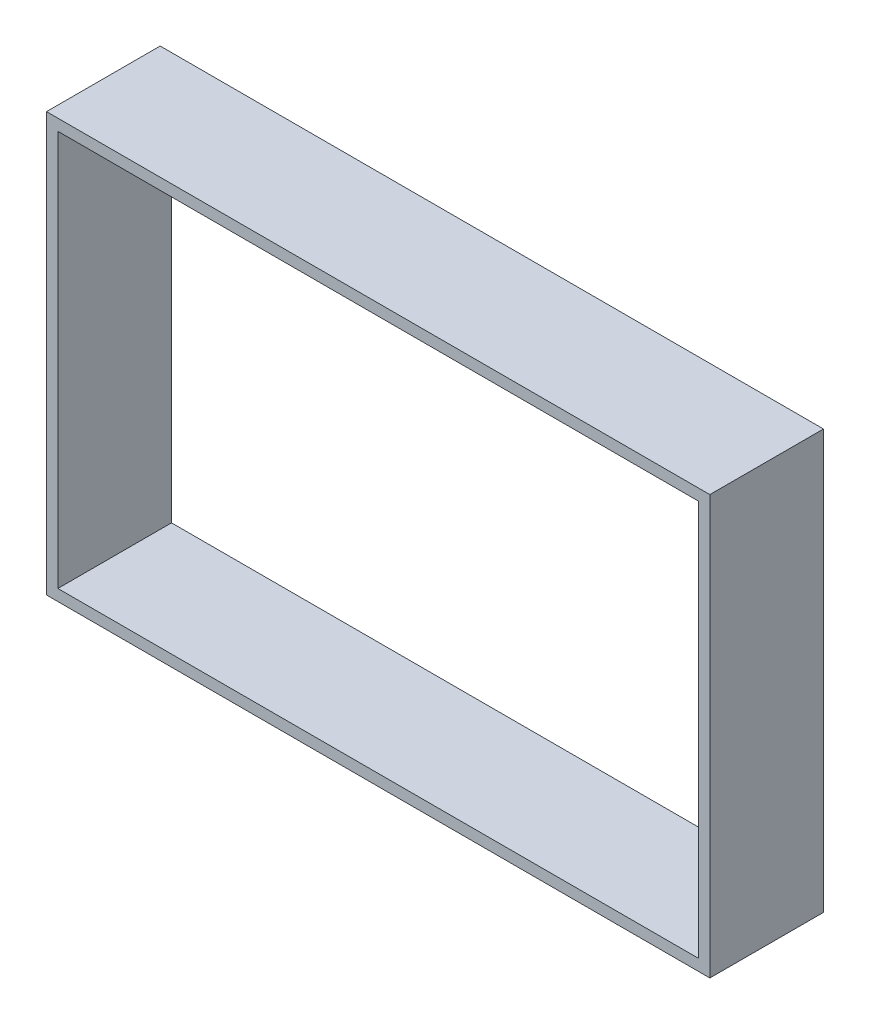
ISO-10303-21;
HEADER;
FILE_DESCRIPTION(('STEP AP214'),'2;1');
FILE_NAME('part.step','',(''),(''),'','','');
FILE_SCHEMA(('AUTOMOTIVE_DESIGN { 1 0 10303 214 1 1 1 1 }'));
ENDSEC;
DATA;
#1=APPLICATION_CONTEXT('core data for automotive mechanical design processes');
#2=APPLICATION_PROTOCOL_DEFINITION('international standard','automotive_design',2000,#1);
#3=PRODUCT_CONTEXT('',#1,'mechanical');
#4=PRODUCT('Part','Part','',(#3));
#5=PRODUCT_RELATED_PRODUCT_CATEGORY('part','',(#4));
#6=PRODUCT_DEFINITION_FORMATION('','',#4);
#7=PRODUCT_DEFINITION_CONTEXT('part definition',#1,'design');
#8=PRODUCT_DEFINITION('design','',#6,#7);
#9=PRODUCT_DEFINITION_SHAPE('','',#8);
#10=(LENGTH_UNIT() NAMED_UNIT(*) SI_UNIT(.MILLI.,.METRE.));
#11=(NAMED_UNIT(*) PLANE_ANGLE_UNIT() SI_UNIT($,.RADIAN.));
#12=(NAMED_UNIT(*) SI_UNIT($,.STERADIAN.) SOLID_ANGLE_UNIT());
#13=UNCERTAINTY_MEASURE_WITH_UNIT(LENGTH_MEASURE(1.E-05),#10,'distance_accuracy_value','');
#14=(GEOMETRIC_REPRESENTATION_CONTEXT(3) GLOBAL_UNCERTAINTY_ASSIGNED_CONTEXT((#13)) GLOBAL_UNIT_ASSIGNED_CONTEXT((#10,
#11,#12)) REPRESENTATION_CONTEXT('',''));
#15=CARTESIAN_POINT('',(0.,0.,0.));
#16=DIRECTION('',(0.,0.,1.));
#17=DIRECTION('',(1.,0.,0.));
#18=AXIS2_PLACEMENT_3D('',#15,#16,#17);
#19=CARTESIAN_POINT('',(-558.293182196081,40.5041750189231,2108.04537891594));
#20=DIRECTION('',(0.,-1.,0.));
#21=DIRECTION('',(1.,0.,0.));
#22=AXIS2_PLACEMENT_3D('',#19,#20,#21);
#23=PLANE('',#22);
#24=DIRECTION('',(-1.,0.,0.));
#25=VECTOR('',#24,1.);
#26=CARTESIAN_POINT('',(-558.293182196081,40.5041750189231,2008.04537891594));
#27=LINE('',#26,#25);
#28=CARTESIAN_POINT('',(23.4068178039194,40.5041750189231,2008.04537891594));
#29=VERTEX_POINT('',#28);
#30=CARTESIAN_POINT('',(-560.293182196081,40.5041750189231,2008.04537891594));
#31=VERTEX_POINT('',#30);
#32=EDGE_CURVE('E51',#29,#31,#27,.T.);
#33=ORIENTED_EDGE('',*,*,#32,.F.);
#34=DIRECTION('',(0.,0.,-1.));
#35=VECTOR('',#34,1.);
#36=CARTESIAN_POINT('',(23.4068178039194,40.5041750189231,2476.45080775759));
#37=LINE('',#36,#35);
#38=CARTESIAN_POINT('',(23.4068178039194,40.5041750189231,2108.04537891594));
#39=VERTEX_POINT('',#38);
#40=EDGE_CURVE('E166',#39,#29,#37,.T.);
#41=ORIENTED_EDGE('',*,*,#40,.F.);
#42=DIRECTION('',(-1.,0.,0.));
#43=VECTOR('',#42,1.);
#44=CARTESIAN_POINT('',(-558.293182196081,40.5041750189231,2108.04537891594));
#45=LINE('',#44,#43);
#46=CARTESIAN_POINT('',(-560.293182196081,40.5041750189231,2108.04537891594));
#47=VERTEX_POINT('',#46);
#48=EDGE_CURVE('E12',#39,#47,#45,.T.);
#49=ORIENTED_EDGE('',*,*,#48,.T.);
#50=DIRECTION('',(0.,0.,-1.));
#51=VECTOR('',#50,1.);
#52=CARTESIAN_POINT('',(-560.293182196081,40.5041750189231,2476.45080775759));
#53=LINE('',#52,#51);
#54=EDGE_CURVE('E151',#47,#31,#53,.T.);
#55=ORIENTED_EDGE('',*,*,#54,.T.);
#56=EDGE_LOOP('',(#33,#41,#49,#55));
#57=FACE_BOUND('',#56,.T.);
#58=ADVANCED_FACE('F47',(#57),#23,.T.);
#59=CARTESIAN_POINT('',(-558.293182196081,408.904175018923,2108.04537891594));
#60=DIRECTION('',(0.,1.,0.));
#61=DIRECTION('',(-1.,0.,0.));
#62=AXIS2_PLACEMENT_3D('',#59,#60,#61);
#63=PLANE('',#62);
#64=DIRECTION('',(1.,0.,0.));
#65=VECTOR('',#64,1.);
#66=CARTESIAN_POINT('',(-558.293182196081,408.904175018923,2008.04537891594));
#67=LINE('',#66,#65);
#68=CARTESIAN_POINT('',(-560.293182196081,408.904175018923,2008.04537891594));
#69=VERTEX_POINT('',#68);
#70=CARTESIAN_POINT('',(23.4068178039194,408.904175018923,2008.04537891594));
#71=VERTEX_POINT('',#70);
#72=EDGE_CURVE('E171',#69,#71,#67,.T.);
#73=ORIENTED_EDGE('',*,*,#72,.F.);
#74=DIRECTION('',(0.,0.,-1.));
#75=VECTOR('',#74,1.);
#76=CARTESIAN_POINT('',(-560.293182196081,408.904175018923,2476.45080775759));
#77=LINE('',#76,#75);
#78=CARTESIAN_POINT('',(-560.293182196081,408.904175018923,2108.04537891594));
#79=VERTEX_POINT('',#78);
#80=EDGE_CURVE('E155',#79,#69,#77,.T.);
#81=ORIENTED_EDGE('',*,*,#80,.F.);
#82=DIRECTION('',(1.,0.,0.));
#83=VECTOR('',#82,1.);
#84=CARTESIAN_POINT('',(-558.293182196081,408.904175018923,2108.04537891594));
#85=LINE('',#84,#83);
#86=CARTESIAN_POINT('',(23.4068178039194,408.904175018923,2108.04537891594));
#87=VERTEX_POINT('',#86);
#88=EDGE_CURVE('E57',#79,#87,#85,.T.);
#89=ORIENTED_EDGE('',*,*,#88,.T.);
#90=DIRECTION('',(0.,0.,-1.));
#91=VECTOR('',#90,1.);
#92=CARTESIAN_POINT('',(23.4068178039194,408.904175018923,2476.45080775759));
#93=LINE('',#92,#91);
#94=EDGE_CURVE('E162',#87,#71,#93,.T.);
#95=ORIENTED_EDGE('',*,*,#94,.T.);
#96=EDGE_LOOP('',(#73,#81,#89,#95));
#97=FACE_BOUND('',#96,.T.);
#98=ADVANCED_FACE('F49',(#97),#63,.T.);
#99=CARTESIAN_POINT('',(0.,0.,2108.04537891594));
#100=DIRECTION('',(0.,0.,1.));
#101=DIRECTION('',(1.,0.,0.));
#102=AXIS2_PLACEMENT_3D('',#99,#100,#101);
#103=PLANE('',#102);
#104=DIRECTION('',(1.,0.,0.));
#105=VECTOR('',#104,1.);
#106=CARTESIAN_POINT('',(-548.293182196081,398.904175018923,2108.04537891594));
#107=LINE('',#106,#105);
#108=CARTESIAN_POINT('',(-550.293182196081,398.904175018923,2108.04537891594));
#109=VERTEX_POINT('',#108);
#110=CARTESIAN_POINT('',(13.4068178039194,398.904175018923,2108.04537891594));
#111=VERTEX_POINT('',#110);
#112=EDGE_CURVE('E108',#109,#111,#107,.T.);
#113=ORIENTED_EDGE('',*,*,#112,.T.);
#114=DIRECTION('',(0.,-1.,0.));
#115=VECTOR('',#114,1.);
#116=CARTESIAN_POINT('',(13.4068178039194,398.904175018923,2108.04537891594));
#117=LINE('',#116,#115);
#118=CARTESIAN_POINT('',(13.4068178039193,50.5041750189231,2108.04537891594));
#119=VERTEX_POINT('',#118);
#120=EDGE_CURVE('E112',#111,#119,#117,.T.);
#121=ORIENTED_EDGE('',*,*,#120,.T.);
#122=DIRECTION('',(-1.,0.,0.));
#123=VECTOR('',#122,1.);
#124=CARTESIAN_POINT('',(-548.293182196081,50.5041750189231,2108.04537891594));
#125=LINE('',#124,#123);
#126=CARTESIAN_POINT('',(-550.293182196081,50.5041750189231,2108.04537891594));
#127=VERTEX_POINT('',#126);
#128=EDGE_CURVE('E119',#119,#127,#125,.T.);
#129=ORIENTED_EDGE('',*,*,#128,.T.);
#130=DIRECTION('',(0.,1.,0.));
#131=VECTOR('',#130,1.);
#132=CARTESIAN_POINT('',(-550.293182196081,398.904175018923,2108.04537891594));
#133=LINE('',#132,#131);
#134=EDGE_CURVE('E114',#127,#109,#133,.T.);
#135=ORIENTED_EDGE('',*,*,#134,.T.);
#136=EDGE_LOOP('',(#113,#121,#129,#135));
#137=FACE_BOUND('',#136,.T.);
#138=ORIENTED_EDGE('',*,*,#88,.F.);
#139=DIRECTION('',(0.,1.,0.));
#140=VECTOR('',#139,1.);
#141=CARTESIAN_POINT('',(-560.293182196081,408.904175018923,2108.04537891594));
#142=LINE('',#141,#140);
#143=EDGE_CURVE('E152',#47,#79,#142,.T.);
#144=ORIENTED_EDGE('',*,*,#143,.F.);
#145=ORIENTED_EDGE('',*,*,#48,.F.);
#146=DIRECTION('',(0.,-1.,0.));
#147=VECTOR('',#146,1.);
#148=CARTESIAN_POINT('',(23.4068178039194,408.904175018923,2108.04537891594));
#149=LINE('',#148,#147);
#150=EDGE_CURVE('E163',#87,#39,#149,.T.);
#151=ORIENTED_EDGE('',*,*,#150,.F.);
#152=EDGE_LOOP('',(#138,#144,#145,#151));
#153=FACE_BOUND('',#152,.T.);
#154=ADVANCED_FACE('F110',(#137,#153),#103,.T.);
#155=CARTESIAN_POINT('',(0.,0.,2008.04537891594));
#156=DIRECTION('',(0.,0.,1.));
#157=DIRECTION('',(1.,0.,0.));
#158=AXIS2_PLACEMENT_3D('',#155,#156,#157);
#159=PLANE('',#158);
#160=DIRECTION('',(0.,-1.,0.));
#161=VECTOR('',#160,1.);
#162=CARTESIAN_POINT('',(13.4068178039194,398.904175018923,2008.04537891594));
#163=LINE('',#162,#161);
#164=CARTESIAN_POINT('',(13.4068178039194,398.904175018923,2008.04537891594));
#165=VERTEX_POINT('',#164);
#166=CARTESIAN_POINT('',(13.4068178039193,50.5041750189231,2008.04537891594));
#167=VERTEX_POINT('',#166);
#168=EDGE_CURVE('E134',#165,#167,#163,.T.);
#169=ORIENTED_EDGE('',*,*,#168,.F.);
#170=DIRECTION('',(1.,0.,0.));
#171=VECTOR('',#170,1.);
#172=CARTESIAN_POINT('',(-548.293182196081,398.904175018923,2008.04537891594));
#173=LINE('',#172,#171);
#174=CARTESIAN_POINT('',(-550.293182196081,398.904175018923,2008.04537891594));
#175=VERTEX_POINT('',#174);
#176=EDGE_CURVE('E133',#175,#165,#173,.T.);
#177=ORIENTED_EDGE('',*,*,#176,.F.);
#178=DIRECTION('',(0.,1.,0.));
#179=VECTOR('',#178,1.);
#180=CARTESIAN_POINT('',(-550.293182196081,398.904175018923,2008.04537891594));
#181=LINE('',#180,#179);
#182=CARTESIAN_POINT('',(-550.293182196081,50.5041750189231,2008.04537891594));
#183=VERTEX_POINT('',#182);
#184=EDGE_CURVE('E140',#183,#175,#181,.T.);
#185=ORIENTED_EDGE('',*,*,#184,.F.);
#186=DIRECTION('',(-1.,0.,0.));
#187=VECTOR('',#186,1.);
#188=CARTESIAN_POINT('',(-548.293182196081,50.5041750189231,2008.04537891594));
#189=LINE('',#188,#187);
#190=EDGE_CURVE('E120',#167,#183,#189,.T.);
#191=ORIENTED_EDGE('',*,*,#190,.F.);
#192=EDGE_LOOP('',(#169,#177,#185,#191));
#193=FACE_BOUND('',#192,.T.);
#194=ORIENTED_EDGE('',*,*,#32,.T.);
#195=DIRECTION('',(0.,1.,0.));
#196=VECTOR('',#195,1.);
#197=CARTESIAN_POINT('',(-560.293182196081,408.904175018923,2008.04537891594));
#198=LINE('',#197,#196);
#199=EDGE_CURVE('E148',#31,#69,#198,.T.);
#200=ORIENTED_EDGE('',*,*,#199,.T.);
#201=ORIENTED_EDGE('',*,*,#72,.T.);
#202=DIRECTION('',(0.,-1.,0.));
#203=VECTOR('',#202,1.);
#204=CARTESIAN_POINT('',(23.4068178039194,408.904175018923,2008.04537891594));
#205=LINE('',#204,#203);
#206=EDGE_CURVE('E158',#71,#29,#205,.T.);
#207=ORIENTED_EDGE('',*,*,#206,.T.);
#208=EDGE_LOOP('',(#194,#200,#201,#207));
#209=FACE_BOUND('',#208,.T.);
#210=ADVANCED_FACE('F175',(#193,#209),#159,.F.);
#211=CARTESIAN_POINT('',(-548.293182196081,50.5041750189231,2108.04537891594));
#212=DIRECTION('',(0.,-1.,0.));
#213=DIRECTION('',(1.,0.,0.));
#214=AXIS2_PLACEMENT_3D('',#211,#212,#213);
#215=PLANE('',#214);
#216=ORIENTED_EDGE('',*,*,#190,.T.);
#217=DIRECTION('',(0.,0.,-1.));
#218=VECTOR('',#217,1.);
#219=CARTESIAN_POINT('',(-550.293182196081,50.5041750189231,2456.45111939678));
#220=LINE('',#219,#218);
#221=EDGE_CURVE('E143',#127,#183,#220,.T.);
#222=ORIENTED_EDGE('',*,*,#221,.F.);
#223=ORIENTED_EDGE('',*,*,#128,.F.);
#224=DIRECTION('',(0.,0.,-1.));
#225=VECTOR('',#224,1.);
#226=CARTESIAN_POINT('',(13.4068178039193,50.5041750189231,2456.45111939678));
#227=LINE('',#226,#225);
#228=EDGE_CURVE('E130',#119,#167,#227,.T.);
#229=ORIENTED_EDGE('',*,*,#228,.T.);
#230=EDGE_LOOP('',(#216,#222,#223,#229));
#231=FACE_BOUND('',#230,.T.);
#232=ADVANCED_FACE('F195',(#231),#215,.F.);
#233=CARTESIAN_POINT('',(-548.293182196081,398.904175018923,2108.04537891594));
#234=DIRECTION('',(0.,1.,0.));
#235=DIRECTION('',(-1.,0.,0.));
#236=AXIS2_PLACEMENT_3D('',#233,#234,#235);
#237=PLANE('',#236);
#238=ORIENTED_EDGE('',*,*,#176,.T.);
#239=DIRECTION('',(0.,0.,-1.));
#240=VECTOR('',#239,1.);
#241=CARTESIAN_POINT('',(13.4068178039194,398.904175018923,2456.45111939678));
#242=LINE('',#241,#240);
#243=EDGE_CURVE('E127',#111,#165,#242,.T.);
#244=ORIENTED_EDGE('',*,*,#243,.F.);
#245=ORIENTED_EDGE('',*,*,#112,.F.);
#246=DIRECTION('',(0.,0.,-1.));
#247=VECTOR('',#246,1.);
#248=CARTESIAN_POINT('',(-550.293182196081,398.904175018923,2456.45111939678));
#249=LINE('',#248,#247);
#250=EDGE_CURVE('E136',#109,#175,#249,.T.);
#251=ORIENTED_EDGE('',*,*,#250,.T.);
#252=EDGE_LOOP('',(#238,#244,#245,#251));
#253=FACE_BOUND('',#252,.T.);
#254=ADVANCED_FACE('F132',(#253),#237,.F.);
#255=CARTESIAN_POINT('',(23.4068178039194,408.904175018923,2476.45080775759));
#256=DIRECTION('',(1.,0.,0.));
#257=DIRECTION('',(0.,1.,0.));
#258=AXIS2_PLACEMENT_3D('',#255,#256,#257);
#259=PLANE('',#258);
#260=ORIENTED_EDGE('',*,*,#94,.F.);
#261=ORIENTED_EDGE('',*,*,#150,.T.);
#262=ORIENTED_EDGE('',*,*,#40,.T.);
#263=ORIENTED_EDGE('',*,*,#206,.F.);
#264=EDGE_LOOP('',(#260,#261,#262,#263));
#265=FACE_BOUND('',#264,.T.);
#266=ADVANCED_FACE('F188',(#265),#259,.T.);
#267=CARTESIAN_POINT('',(-560.293182196081,408.904175018923,2476.45080775759));
#268=DIRECTION('',(-1.,0.,0.));
#269=DIRECTION('',(0.,0.,1.));
#270=AXIS2_PLACEMENT_3D('',#267,#268,#269);
#271=PLANE('',#270);
#272=ORIENTED_EDGE('',*,*,#54,.F.);
#273=ORIENTED_EDGE('',*,*,#143,.T.);
#274=ORIENTED_EDGE('',*,*,#80,.T.);
#275=ORIENTED_EDGE('',*,*,#199,.F.);
#276=EDGE_LOOP('',(#272,#273,#274,#275));
#277=FACE_BOUND('',#276,.T.);
#278=ADVANCED_FACE('F182',(#277),#271,.T.);
#279=CARTESIAN_POINT('',(-550.293182196081,398.904175018923,2456.45111939678));
#280=DIRECTION('',(-1.,0.,0.));
#281=DIRECTION('',(0.,0.,1.));
#282=AXIS2_PLACEMENT_3D('',#279,#280,#281);
#283=PLANE('',#282);
#284=ORIENTED_EDGE('',*,*,#221,.T.);
#285=ORIENTED_EDGE('',*,*,#184,.T.);
#286=ORIENTED_EDGE('',*,*,#250,.F.);
#287=ORIENTED_EDGE('',*,*,#134,.F.);
#288=EDGE_LOOP('',(#284,#285,#286,#287));
#289=FACE_BOUND('',#288,.T.);
#290=ADVANCED_FACE('F226',(#289),#283,.F.);
#291=CARTESIAN_POINT('',(13.4068178039194,398.904175018923,2456.45111939678));
#292=DIRECTION('',(1.,0.,0.));
#293=DIRECTION('',(0.,1.,0.));
#294=AXIS2_PLACEMENT_3D('',#291,#292,#293);
#295=PLANE('',#294);
#296=ORIENTED_EDGE('',*,*,#243,.T.);
#297=ORIENTED_EDGE('',*,*,#168,.T.);
#298=ORIENTED_EDGE('',*,*,#228,.F.);
#299=ORIENTED_EDGE('',*,*,#120,.F.);
#300=EDGE_LOOP('',(#296,#297,#298,#299));
#301=FACE_BOUND('',#300,.T.);
#302=ADVANCED_FACE('F125',(#301),#295,.F.);
#303=CLOSED_SHELL('',(#58,#98,#154,#210,#232,#254,#266,#278,#290,#302));
#304=MANIFOLD_SOLID_BREP('B2',#303);
#305=ADVANCED_BREP_SHAPE_REPRESENTATION('',(#18,#304),#14);
#306=SHAPE_DEFINITION_REPRESENTATION(#9,#305);
ENDSEC;
END-ISO-10303-21;
